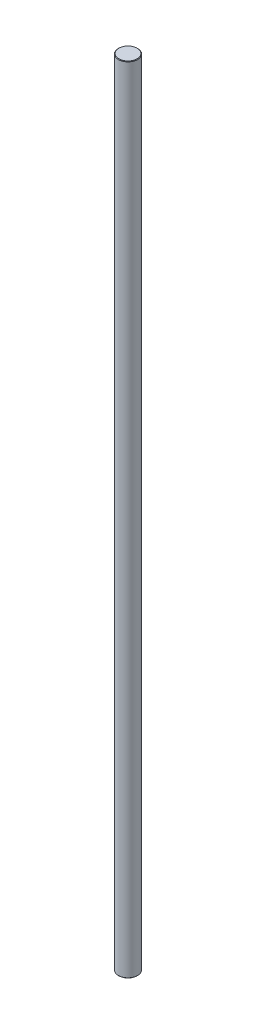
ISO-10303-21;
HEADER;
FILE_DESCRIPTION(('STEP AP214'),'2;1');
FILE_NAME('part.step','',(''),(''),'','','');
FILE_SCHEMA(('AUTOMOTIVE_DESIGN { 1 0 10303 214 1 1 1 1 }'));
ENDSEC;
DATA;
#1=APPLICATION_CONTEXT('core data for automotive mechanical design processes');
#2=APPLICATION_PROTOCOL_DEFINITION('international standard','automotive_design',2000,#1);
#3=PRODUCT_CONTEXT('',#1,'mechanical');
#4=PRODUCT('Part','Part','',(#3));
#5=PRODUCT_RELATED_PRODUCT_CATEGORY('part','',(#4));
#6=PRODUCT_DEFINITION_FORMATION('','',#4);
#7=PRODUCT_DEFINITION_CONTEXT('part definition',#1,'design');
#8=PRODUCT_DEFINITION('design','',#6,#7);
#9=PRODUCT_DEFINITION_SHAPE('','',#8);
#10=(LENGTH_UNIT() NAMED_UNIT(*) SI_UNIT(.MILLI.,.METRE.));
#11=(NAMED_UNIT(*) PLANE_ANGLE_UNIT() SI_UNIT($,.RADIAN.));
#12=(NAMED_UNIT(*) SI_UNIT($,.STERADIAN.) SOLID_ANGLE_UNIT());
#13=UNCERTAINTY_MEASURE_WITH_UNIT(LENGTH_MEASURE(1.E-05),#10,'distance_accuracy_value','');
#14=(GEOMETRIC_REPRESENTATION_CONTEXT(3) GLOBAL_UNCERTAINTY_ASSIGNED_CONTEXT((#13)) GLOBAL_UNIT_ASSIGNED_CONTEXT((#10,
#11,#12)) REPRESENTATION_CONTEXT('',''));
#15=CARTESIAN_POINT('',(0.,0.,0.));
#16=DIRECTION('',(0.,0.,1.));
#17=DIRECTION('',(1.,0.,0.));
#18=AXIS2_PLACEMENT_3D('',#15,#16,#17);
#19=CARTESIAN_POINT('',(0.,330.,0.));
#20=DIRECTION('',(0.,-1.,0.));
#21=DIRECTION('',(0.,0.,-1.));
#22=AXIS2_PLACEMENT_3D('',#19,#20,#21);
#23=CYLINDRICAL_SURFACE('',#22,4.);
#24=CARTESIAN_POINT('',(0.,0.199999999999922,0.));
#25=DIRECTION('',(0.,1.,0.));
#26=DIRECTION('',(0.,0.,1.));
#27=AXIS2_PLACEMENT_3D('',#24,#25,#26);
#28=CIRCLE('',#27,4.);
#29=CARTESIAN_POINT('',(0.,0.199999999999922,4.));
#30=VERTEX_POINT('',#29);
#31=EDGE_CURVE('E43',#30,#30,#28,.T.);
#32=ORIENTED_EDGE('',*,*,#31,.T.);
#33=EDGE_LOOP('',(#32));
#34=FACE_BOUND('',#33,.T.);
#35=CARTESIAN_POINT('',(0.,329.8,0.));
#36=DIRECTION('',(0.,1.,0.));
#37=DIRECTION('',(0.,0.,1.));
#38=AXIS2_PLACEMENT_3D('',#35,#36,#37);
#39=CIRCLE('',#38,4.);
#40=CARTESIAN_POINT('',(0.,329.8,4.));
#41=VERTEX_POINT('',#40);
#42=EDGE_CURVE('E47',#41,#41,#39,.F.);
#43=ORIENTED_EDGE('',*,*,#42,.T.);
#44=EDGE_LOOP('',(#43));
#45=FACE_BOUND('',#44,.T.);
#46=ADVANCED_FACE('F32',(#34,#45),#23,.T.);
#47=CARTESIAN_POINT('',(0.,330.,0.));
#48=DIRECTION('',(0.,1.,0.));
#49=DIRECTION('',(0.,0.,1.));
#50=AXIS2_PLACEMENT_3D('',#47,#48,#49);
#51=PLANE('',#50);
#52=CARTESIAN_POINT('',(0.,330.,0.));
#53=DIRECTION('',(0.,1.,0.));
#54=DIRECTION('',(0.,0.,1.));
#55=AXIS2_PLACEMENT_3D('',#52,#53,#54);
#56=CIRCLE('',#55,3.80000000000011);
#57=CARTESIAN_POINT('',(0.,330.,3.80000000000011));
#58=VERTEX_POINT('',#57);
#59=EDGE_CURVE('E10',#58,#58,#56,.T.);
#60=ORIENTED_EDGE('',*,*,#59,.T.);
#61=EDGE_LOOP('',(#60));
#62=FACE_BOUND('',#61,.T.);
#63=ADVANCED_FACE('F63',(#62),#51,.T.);
#64=CARTESIAN_POINT('',(0.,0.,0.));
#65=DIRECTION('',(0.,1.,0.));
#66=DIRECTION('',(0.,0.,1.));
#67=AXIS2_PLACEMENT_3D('',#64,#65,#66);
#68=PLANE('',#67);
#69=CARTESIAN_POINT('',(0.,0.,0.));
#70=DIRECTION('',(0.,1.,0.));
#71=DIRECTION('',(0.,0.,1.));
#72=AXIS2_PLACEMENT_3D('',#69,#70,#71);
#73=CIRCLE('',#72,3.80000000000008);
#74=CARTESIAN_POINT('',(0.,0.,3.80000000000008));
#75=VERTEX_POINT('',#74);
#76=EDGE_CURVE('E39',#75,#75,#73,.F.);
#77=ORIENTED_EDGE('',*,*,#76,.T.);
#78=EDGE_LOOP('',(#77));
#79=FACE_BOUND('',#78,.T.);
#80=ADVANCED_FACE('F60',(#79),#68,.F.);
#81=CARTESIAN_POINT('',(0.,0.199999999999922,0.));
#82=DIRECTION('',(0.,1.,0.));
#83=DIRECTION('',(0.,0.,1.));
#84=AXIS2_PLACEMENT_3D('',#81,#82,#83);
#85=CONICAL_SURFACE('',#84,4.,0.78539816339744);
#86=CARTESIAN_POINT('',(0.,0.,3.80000000000008));
#87=CARTESIAN_POINT('',(0.,0.00208333333333239,3.80208333333341));
#88=CARTESIAN_POINT('',(0.,0.00416666666666495,3.80416666666675));
#89=CARTESIAN_POINT('',(0.,0.00833333333333008,3.80833333333341));
#90=CARTESIAN_POINT('',(0.,0.0104166666666626,3.81041666666674));
#91=CARTESIAN_POINT('',(0.,0.0145833333333277,3.81458333333341));
#92=CARTESIAN_POINT('',(0.,0.0166666666666602,3.81666666666674));
#93=CARTESIAN_POINT('',(0.,0.0208333333333252,3.82083333333341));
#94=CARTESIAN_POINT('',(0.,0.0229166666666578,3.82291666666674));
#95=CARTESIAN_POINT('',(0.,0.0270833333333228,3.8270833333334));
#96=CARTESIAN_POINT('',(0.,0.0291666666666553,3.82916666666674));
#97=CARTESIAN_POINT('',(0.,0.0333333333333204,3.8333333333334));
#98=CARTESIAN_POINT('',(0.,0.0354166666666529,3.83541666666673));
#99=CARTESIAN_POINT('',(0.,0.039583333333318,3.8395833333334));
#100=CARTESIAN_POINT('',(0.,0.0416666666666505,3.84166666666673));
#101=CARTESIAN_POINT('',(0.,0.0458333333333155,3.8458333333334));
#102=CARTESIAN_POINT('',(0.,0.0479166666666481,3.84791666666673));
#103=CARTESIAN_POINT('',(0.,0.0520833333333131,3.85208333333339));
#104=CARTESIAN_POINT('',(0.,0.0541666666666456,3.85416666666673));
#105=CARTESIAN_POINT('',(0.,0.0583333333333107,3.85833333333339));
#106=CARTESIAN_POINT('',(0.,0.0604166666666432,3.86041666666672));
#107=CARTESIAN_POINT('',(0.,0.0645833333333083,3.86458333333339));
#108=CARTESIAN_POINT('',(0.,0.0666666666666408,3.86666666666672));
#109=CARTESIAN_POINT('',(0.,0.0708333333333058,3.87083333333339));
#110=CARTESIAN_POINT('',(0.,0.0729166666666384,3.87291666666672));
#111=CARTESIAN_POINT('',(0.,0.0770833333333034,3.87708333333338));
#112=CARTESIAN_POINT('',(0.,0.0791666666666359,3.87916666666672));
#113=CARTESIAN_POINT('',(0.,0.083333333333301,3.88333333333338));
#114=CARTESIAN_POINT('',(0.,0.0854166666666336,3.88541666666671));
#115=CARTESIAN_POINT('',(0.,0.0895833333332986,3.88958333333338));
#116=CARTESIAN_POINT('',(0.,0.0916666666666311,3.89166666666671));
#117=CARTESIAN_POINT('',(0.,0.0958333333332961,3.89583333333338));
#118=CARTESIAN_POINT('',(0.,0.0979166666666287,3.89791666666671));
#119=CARTESIAN_POINT('',(0.,0.102083333333294,3.90208333333337));
#120=CARTESIAN_POINT('',(0.,0.104166666666626,3.90416666666671));
#121=CARTESIAN_POINT('',(0.,0.108333333333291,3.90833333333337));
#122=CARTESIAN_POINT('',(0.,0.110416666666624,3.9104166666667));
#123=CARTESIAN_POINT('',(0.,0.114583333333289,3.91458333333337));
#124=CARTESIAN_POINT('',(0.,0.116666666666621,3.9166666666667));
#125=CARTESIAN_POINT('',(0.,0.120833333333286,3.92083333333337));
#126=CARTESIAN_POINT('',(0.,0.122916666666619,3.9229166666667));
#127=CARTESIAN_POINT('',(0.,0.127083333333284,3.92708333333336));
#128=CARTESIAN_POINT('',(0.,0.129166666666617,3.9291666666667));
#129=CARTESIAN_POINT('',(0.,0.133333333333282,3.93333333333336));
#130=CARTESIAN_POINT('',(0.,0.135416666666614,3.93541666666669));
#131=CARTESIAN_POINT('',(0.,0.139583333333279,3.93958333333336));
#132=CARTESIAN_POINT('',(0.,0.141666666666612,3.94166666666669));
#133=CARTESIAN_POINT('',(0.,0.145833333333277,3.94583333333336));
#134=CARTESIAN_POINT('',(0.,0.147916666666609,3.94791666666669));
#135=CARTESIAN_POINT('',(0.,0.152083333333274,3.95208333333335));
#136=CARTESIAN_POINT('',(0.,0.154166666666607,3.95416666666669));
#137=CARTESIAN_POINT('',(0.,0.158333333333272,3.95833333333335));
#138=CARTESIAN_POINT('',(0.,0.160416666666604,3.96041666666668));
#139=CARTESIAN_POINT('',(0.,0.16458333333327,3.96458333333335));
#140=CARTESIAN_POINT('',(0.,0.166666666666602,3.96666666666668));
#141=CARTESIAN_POINT('',(0.,0.170833333333267,3.97083333333335));
#142=CARTESIAN_POINT('',(0.,0.1729166666666,3.97291666666668));
#143=CARTESIAN_POINT('',(0.,0.177083333333265,3.97708333333334));
#144=CARTESIAN_POINT('',(0.,0.179166666666597,3.97916666666667));
#145=CARTESIAN_POINT('',(0.,0.183333333333262,3.98333333333334));
#146=CARTESIAN_POINT('',(0.,0.185416666666595,3.98541666666667));
#147=CARTESIAN_POINT('',(0.,0.18958333333326,3.98958333333334));
#148=CARTESIAN_POINT('',(0.,0.191666666666592,3.99166666666667));
#149=CARTESIAN_POINT('',(0.,0.195833333333257,3.99583333333333));
#150=CARTESIAN_POINT('',(0.,0.19791666666659,3.99791666666667));
#151=CARTESIAN_POINT('',(0.,0.199999999999922,4.));
#152=B_SPLINE_CURVE_WITH_KNOTS('',3,(#86,#87,#88,#89,#90,#91,#92,#93,#94,#95,#96,#97,#98,#99,
#100,#101,#102,#103,#104,#105,#106,#107,#108,#109,#110,#111,#112,#113,#114,#115,#116,#117,#118,
#119,#120,#121,#122,#123,#124,#125,#126,#127,#128,#129,#130,#131,#132,#133,#134,#135,#136,#137,
#138,#139,#140,#141,#142,#143,#144,#145,#146,#147,#148,#149,#150,#151),.UNSPECIFIED.,.F.,.F.,(4,
2,2,2,2,2,2,2,2,2,2,2,2,2,2,2,2,2,2,2,2,2,2,2,2,2,2,2,2,2,2,2,4),(0.,0.00883883476482842,
0.0176776695296565,0.0265165042944849,0.0353553390593134,0.0441941738241418,0.0530330085889699,
0.0618718433537983,0.0707106781186267,0.0795495128834551,0.0883883476482833,0.0972271824131117,
0.10606601717794,0.114904851942769,0.123743686707597,0.132582521472425,0.141421356237253,
0.150260191002082,0.15909902576691,0.167937860531739,0.176776695296567,0.185615530061395,
0.194454364826223,0.203293199591052,0.21213203435588,0.220970869120709,0.229809703885537,
0.238648538650365,0.247487373415194,0.256326208180022,0.26516504294485,0.274003877709679,
0.282842712474507),.UNSPECIFIED.);
#153=EDGE_CURVE('BSEAM56',#75,#30,#152,.T.);
#154=ORIENTED_EDGE('',*,*,#76,.F.);
#155=ORIENTED_EDGE('',*,*,#31,.F.);
#156=ORIENTED_EDGE('',*,*,#153,.T.);
#157=ORIENTED_EDGE('',*,*,#153,.F.);
#158=EDGE_LOOP('',(#154,#156,#155,#157));
#159=FACE_BOUND('',#158,.T.);
#160=ADVANCED_FACE('F56',(#159),#85,.T.);
#161=CARTESIAN_POINT('',(0.,330.,0.));
#162=DIRECTION('',(0.,-1.,0.));
#163=DIRECTION('',(0.,0.,-1.));
#164=AXIS2_PLACEMENT_3D('',#161,#162,#163);
#165=CONICAL_SURFACE('',#164,3.80000000000011,0.785398163397648);
#166=ORIENTED_EDGE('',*,*,#42,.F.);
#167=EDGE_LOOP('',(#166));
#168=FACE_BOUND('',#167,.T.);
#169=ORIENTED_EDGE('',*,*,#59,.F.);
#170=EDGE_LOOP('',(#169));
#171=FACE_BOUND('',#170,.T.);
#172=ADVANCED_FACE('F34',(#168,#171),#165,.T.);
#173=CLOSED_SHELL('',(#46,#63,#80,#160,#172));
#174=MANIFOLD_SOLID_BREP('B2',#173);
#175=ADVANCED_BREP_SHAPE_REPRESENTATION('',(#18,#174),#14);
#176=SHAPE_DEFINITION_REPRESENTATION(#9,#175);
ENDSEC;
END-ISO-10303-21;
